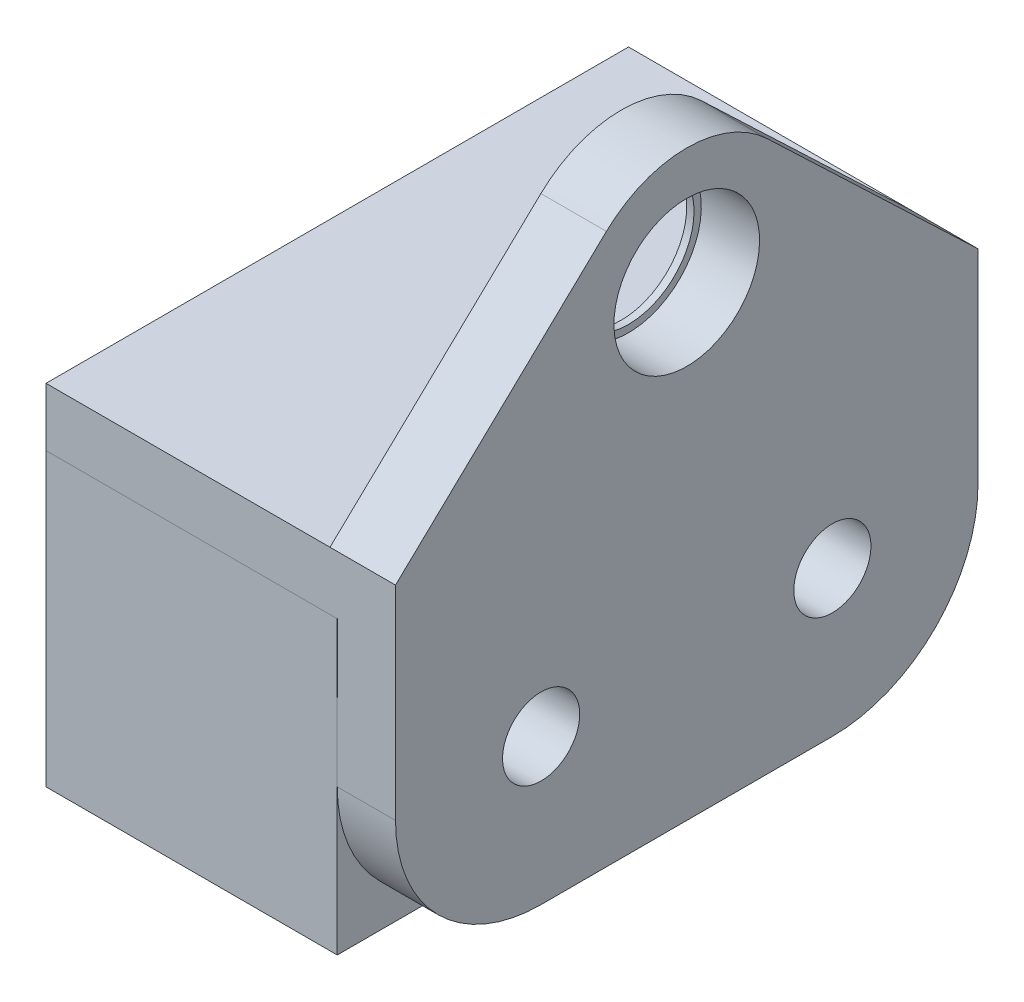
ISO-10303-21;
HEADER;
FILE_DESCRIPTION(('STEP AP214'),'2;1');
FILE_NAME('part.step','',(''),(''),'','','');
FILE_SCHEMA(('AUTOMOTIVE_DESIGN { 1 0 10303 214 1 1 1 1 }'));
ENDSEC;
DATA;
#1=APPLICATION_CONTEXT('core data for automotive mechanical design processes');
#2=APPLICATION_PROTOCOL_DEFINITION('international standard','automotive_design',2000,#1);
#3=PRODUCT_CONTEXT('',#1,'mechanical');
#4=PRODUCT('Part','Part','',(#3));
#5=PRODUCT_RELATED_PRODUCT_CATEGORY('part','',(#4));
#6=PRODUCT_DEFINITION_FORMATION('','',#4);
#7=PRODUCT_DEFINITION_CONTEXT('part definition',#1,'design');
#8=PRODUCT_DEFINITION('design','',#6,#7);
#9=PRODUCT_DEFINITION_SHAPE('','',#8);
#10=(LENGTH_UNIT() NAMED_UNIT(*) SI_UNIT(.MILLI.,.METRE.));
#11=(NAMED_UNIT(*) PLANE_ANGLE_UNIT() SI_UNIT($,.RADIAN.));
#12=(NAMED_UNIT(*) SI_UNIT($,.STERADIAN.) SOLID_ANGLE_UNIT());
#13=UNCERTAINTY_MEASURE_WITH_UNIT(LENGTH_MEASURE(1.E-05),#10,'distance_accuracy_value','');
#14=(GEOMETRIC_REPRESENTATION_CONTEXT(3) GLOBAL_UNCERTAINTY_ASSIGNED_CONTEXT((#13)) GLOBAL_UNIT_ASSIGNED_CONTEXT((#10,
#11,#12)) REPRESENTATION_CONTEXT('',''));
#15=CARTESIAN_POINT('',(0.,0.,0.));
#16=DIRECTION('',(0.,0.,1.));
#17=DIRECTION('',(1.,0.,0.));
#18=AXIS2_PLACEMENT_3D('',#15,#16,#17);
#19=CARTESIAN_POINT('',(-10.,10.,20.));
#20=DIRECTION('',(0.,1.,0.));
#21=DIRECTION('',(-1.,0.,0.));
#22=AXIS2_PLACEMENT_3D('',#19,#20,#21);
#23=PLANE('',#22);
#24=DIRECTION('',(0.,0.,-1.));
#25=VECTOR('',#24,1.);
#26=CARTESIAN_POINT('',(-3.05,10.,8.));
#27=LINE('',#26,#25);
#28=CARTESIAN_POINT('',(-3.05,10.,16.));
#29=VERTEX_POINT('',#28);
#30=CARTESIAN_POINT('',(-3.05,10.,8.));
#31=VERTEX_POINT('',#30);
#32=EDGE_CURVE('E280',#29,#31,#27,.T.);
#33=ORIENTED_EDGE('',*,*,#32,.F.);
#34=DIRECTION('',(-1.,0.,0.));
#35=VECTOR('',#34,1.);
#36=CARTESIAN_POINT('',(-3.05,10.,16.));
#37=LINE('',#36,#35);
#38=CARTESIAN_POINT('',(3.05,10.,16.));
#39=VERTEX_POINT('',#38);
#40=EDGE_CURVE('E285',#39,#29,#37,.T.);
#41=ORIENTED_EDGE('',*,*,#40,.F.);
#42=DIRECTION('',(0.,0.,1.));
#43=VECTOR('',#42,1.);
#44=CARTESIAN_POINT('',(3.05,10.,8.));
#45=LINE('',#44,#43);
#46=CARTESIAN_POINT('',(3.05,10.,8.));
#47=VERTEX_POINT('',#46);
#48=EDGE_CURVE('E294',#47,#39,#45,.T.);
#49=ORIENTED_EDGE('',*,*,#48,.F.);
#50=DIRECTION('',(1.,0.,0.));
#51=VECTOR('',#50,1.);
#52=CARTESIAN_POINT('',(-3.05,10.,8.));
#53=LINE('',#52,#51);
#54=EDGE_CURVE('E291',#31,#47,#53,.T.);
#55=ORIENTED_EDGE('',*,*,#54,.F.);
#56=EDGE_LOOP('',(#33,#41,#49,#55));
#57=FACE_BOUND('',#56,.T.);
#58=DIRECTION('',(0.,0.,1.));
#59=VECTOR('',#58,1.);
#60=CARTESIAN_POINT('',(10.,10.,20.));
#61=LINE('',#60,#59);
#62=CARTESIAN_POINT('',(10.,10.,-20.));
#63=VERTEX_POINT('',#62);
#64=CARTESIAN_POINT('',(10.,10.,20.));
#65=VERTEX_POINT('',#64);
#66=EDGE_CURVE('E306',#63,#65,#61,.T.);
#67=ORIENTED_EDGE('',*,*,#66,.T.);
#68=DIRECTION('',(1.,0.,0.));
#69=VECTOR('',#68,1.);
#70=CARTESIAN_POINT('',(-10.,10.,20.));
#71=LINE('',#70,#69);
#72=CARTESIAN_POINT('',(-10.,10.,20.));
#73=VERTEX_POINT('',#72);
#74=EDGE_CURVE('E317',#73,#65,#71,.T.);
#75=ORIENTED_EDGE('',*,*,#74,.F.);
#76=DIRECTION('',(0.,0.,1.));
#77=VECTOR('',#76,1.);
#78=CARTESIAN_POINT('',(-10.,10.,20.));
#79=LINE('',#78,#77);
#80=CARTESIAN_POINT('',(-10.,10.,-20.));
#81=VERTEX_POINT('',#80);
#82=EDGE_CURVE('E315',#81,#73,#79,.T.);
#83=ORIENTED_EDGE('',*,*,#82,.F.);
#84=DIRECTION('',(1.,0.,0.));
#85=VECTOR('',#84,1.);
#86=CARTESIAN_POINT('',(-10.,10.,-20.));
#87=LINE('',#86,#85);
#88=EDGE_CURVE('E322',#81,#63,#87,.T.);
#89=ORIENTED_EDGE('',*,*,#88,.T.);
#90=EDGE_LOOP('',(#67,#75,#83,#89));
#91=FACE_BOUND('',#90,.T.);
#92=DIRECTION('',(-1.,0.,0.));
#93=VECTOR('',#92,1.);
#94=CARTESIAN_POINT('',(-3.05,10.,-8.));
#95=LINE('',#94,#93);
#96=CARTESIAN_POINT('',(3.05,10.,-8.));
#97=VERTEX_POINT('',#96);
#98=CARTESIAN_POINT('',(-3.05,10.,-8.));
#99=VERTEX_POINT('',#98);
#100=EDGE_CURVE('E253',#97,#99,#95,.T.);
#101=ORIENTED_EDGE('',*,*,#100,.F.);
#102=DIRECTION('',(0.,0.,1.));
#103=VECTOR('',#102,1.);
#104=CARTESIAN_POINT('',(3.05,10.,-8.));
#105=LINE('',#104,#103);
#106=CARTESIAN_POINT('',(3.05,10.,-16.));
#107=VERTEX_POINT('',#106);
#108=EDGE_CURVE('E259',#107,#97,#105,.T.);
#109=ORIENTED_EDGE('',*,*,#108,.F.);
#110=DIRECTION('',(1.,0.,0.));
#111=VECTOR('',#110,1.);
#112=CARTESIAN_POINT('',(-3.05,10.,-16.));
#113=LINE('',#112,#111);
#114=CARTESIAN_POINT('',(-3.05,10.,-16.));
#115=VERTEX_POINT('',#114);
#116=EDGE_CURVE('E268',#115,#107,#113,.T.);
#117=ORIENTED_EDGE('',*,*,#116,.F.);
#118=DIRECTION('',(0.,0.,-1.));
#119=VECTOR('',#118,1.);
#120=CARTESIAN_POINT('',(-3.05,10.,-8.));
#121=LINE('',#120,#119);
#122=EDGE_CURVE('E265',#99,#115,#121,.T.);
#123=ORIENTED_EDGE('',*,*,#122,.F.);
#124=EDGE_LOOP('',(#101,#109,#117,#123));
#125=FACE_BOUND('',#124,.T.);
#126=ADVANCED_FACE('F53',(#57,#91,#125),#23,.F.);
#127=CARTESIAN_POINT('',(9.99999999999999,0.,0.));
#128=DIRECTION('',(1.,0.,0.));
#129=DIRECTION('',(0.,1.,0.));
#130=AXIS2_PLACEMENT_3D('',#127,#128,#129);
#131=PLANE('',#130);
#132=CARTESIAN_POINT('',(9.99999999999999,0.,-10.));
#133=DIRECTION('',(1.,0.,0.));
#134=DIRECTION('',(0.,1.,0.));
#135=AXIS2_PLACEMENT_3D('',#132,#133,#134);
#136=CIRCLE('',#135,2.65);
#137=CARTESIAN_POINT('',(9.99999999999999,2.65,-10.));
#138=VERTEX_POINT('',#137);
#139=EDGE_CURVE('E334',#138,#138,#136,.T.);
#140=ORIENTED_EDGE('',*,*,#139,.T.);
#141=EDGE_LOOP('',(#140));
#142=FACE_BOUND('',#141,.T.);
#143=CARTESIAN_POINT('',(9.99999999999999,0.,10.));
#144=DIRECTION('',(1.,0.,0.));
#145=DIRECTION('',(0.,1.,0.));
#146=AXIS2_PLACEMENT_3D('',#143,#144,#145);
#147=CIRCLE('',#146,2.65);
#148=CARTESIAN_POINT('',(9.99999999999999,2.65,10.));
#149=VERTEX_POINT('',#148);
#150=EDGE_CURVE('E328',#149,#149,#147,.T.);
#151=ORIENTED_EDGE('',*,*,#150,.T.);
#152=EDGE_LOOP('',(#151));
#153=FACE_BOUND('',#152,.T.);
#154=DIRECTION('',(0.,0.,-1.));
#155=VECTOR('',#154,1.);
#156=CARTESIAN_POINT('',(9.99999999999999,-10.,0.));
#157=LINE('',#156,#155);
#158=CARTESIAN_POINT('',(9.99999999999999,-10.,10.));
#159=VERTEX_POINT('',#158);
#160=CARTESIAN_POINT('',(9.99999999999999,-10.,-10.));
#161=VERTEX_POINT('',#160);
#162=EDGE_CURVE('E347',#159,#161,#157,.T.);
#163=ORIENTED_EDGE('',*,*,#162,.F.);
#164=CARTESIAN_POINT('',(9.99999999999999,0.,10.));
#165=DIRECTION('',(1.,0.,0.));
#166=DIRECTION('',(0.,1.,0.));
#167=AXIS2_PLACEMENT_3D('',#164,#165,#166);
#168=CIRCLE('',#167,10.);
#169=CARTESIAN_POINT('',(9.99999999999999,0.,20.));
#170=VERTEX_POINT('',#169);
#171=EDGE_CURVE('E400',#159,#170,#168,.F.);
#172=ORIENTED_EDGE('',*,*,#171,.T.);
#173=DIRECTION('',(0.,1.,0.));
#174=VECTOR('',#173,1.);
#175=CARTESIAN_POINT('',(9.99999999999999,0.,20.));
#176=LINE('',#175,#174);
#177=EDGE_CURVE('E337',#170,#65,#176,.T.);
#178=ORIENTED_EDGE('',*,*,#177,.T.);
#179=ORIENTED_EDGE('',*,*,#66,.F.);
#180=DIRECTION('',(0.,1.,0.));
#181=VECTOR('',#180,1.);
#182=CARTESIAN_POINT('',(9.99999999999999,0.,-20.));
#183=LINE('',#182,#181);
#184=CARTESIAN_POINT('',(9.99999999999999,0.,-20.));
#185=VERTEX_POINT('',#184);
#186=EDGE_CURVE('E341',#185,#63,#183,.T.);
#187=ORIENTED_EDGE('',*,*,#186,.F.);
#188=CARTESIAN_POINT('',(9.99999999999999,0.,-10.));
#189=DIRECTION('',(1.,0.,0.));
#190=DIRECTION('',(0.,1.,0.));
#191=AXIS2_PLACEMENT_3D('',#188,#189,#190);
#192=CIRCLE('',#191,10.);
#193=EDGE_CURVE('E398',#185,#161,#192,.F.);
#194=ORIENTED_EDGE('',*,*,#193,.T.);
#195=EDGE_LOOP('',(#163,#172,#178,#179,#187,#194));
#196=FACE_BOUND('',#195,.T.);
#197=ADVANCED_FACE('F415',(#142,#153,#196),#131,.F.);
#198=CARTESIAN_POINT('',(14.,0.,20.));
#199=DIRECTION('',(0.,0.,1.));
#200=DIRECTION('',(1.,0.,0.));
#201=AXIS2_PLACEMENT_3D('',#198,#199,#200);
#202=PLANE('',#201);
#203=ORIENTED_EDGE('',*,*,#177,.F.);
#204=DIRECTION('',(-1.,0.,0.));
#205=VECTOR('',#204,1.);
#206=CARTESIAN_POINT('',(14.,0.,20.));
#207=LINE('',#206,#205);
#208=CARTESIAN_POINT('',(14.,0.,20.));
#209=VERTEX_POINT('',#208);
#210=EDGE_CURVE('E76',#170,#209,#207,.F.);
#211=ORIENTED_EDGE('',*,*,#210,.T.);
#212=DIRECTION('',(0.,1.,0.));
#213=VECTOR('',#212,1.);
#214=CARTESIAN_POINT('',(14.,0.,20.));
#215=LINE('',#214,#213);
#216=CARTESIAN_POINT('',(14.,14.,20.));
#217=VERTEX_POINT('',#216);
#218=EDGE_CURVE('E338',#209,#217,#215,.T.);
#219=ORIENTED_EDGE('',*,*,#218,.T.);
#220=DIRECTION('',(-1.,0.,0.));
#221=VECTOR('',#220,1.);
#222=CARTESIAN_POINT('',(14.,14.,20.));
#223=LINE('',#222,#221);
#224=CARTESIAN_POINT('',(9.5,14.,20.));
#225=VERTEX_POINT('',#224);
#226=EDGE_CURVE('E351',#217,#225,#223,.T.);
#227=ORIENTED_EDGE('',*,*,#226,.T.);
#228=CARTESIAN_POINT('',(-10.,14.,20.));
#229=VERTEX_POINT('',#228);
#230=EDGE_CURVE('E345',#225,#229,#223,.T.);
#231=ORIENTED_EDGE('',*,*,#230,.T.);
#232=DIRECTION('',(0.,1.,0.));
#233=VECTOR('',#232,1.);
#234=CARTESIAN_POINT('',(-10.,14.,20.));
#235=LINE('',#234,#233);
#236=EDGE_CURVE('E307',#73,#229,#235,.T.);
#237=ORIENTED_EDGE('',*,*,#236,.F.);
#238=ORIENTED_EDGE('',*,*,#74,.T.);
#239=EDGE_LOOP('',(#203,#211,#219,#227,#231,#237,#238));
#240=FACE_BOUND('',#239,.T.);
#241=ADVANCED_FACE('F417',(#240),#202,.T.);
#242=CARTESIAN_POINT('',(14.,-10.,0.));
#243=DIRECTION('',(0.,1.,0.));
#244=DIRECTION('',(-1.,0.,0.));
#245=AXIS2_PLACEMENT_3D('',#242,#243,#244);
#246=PLANE('',#245);
#247=DIRECTION('',(0.,0.,-1.));
#248=VECTOR('',#247,1.);
#249=CARTESIAN_POINT('',(14.,-10.,0.));
#250=LINE('',#249,#248);
#251=CARTESIAN_POINT('',(14.,-10.,10.));
#252=VERTEX_POINT('',#251);
#253=CARTESIAN_POINT('',(14.,-10.,-10.));
#254=VERTEX_POINT('',#253);
#255=EDGE_CURVE('E340',#252,#254,#250,.T.);
#256=ORIENTED_EDGE('',*,*,#255,.F.);
#257=DIRECTION('',(-1.,0.,0.));
#258=VECTOR('',#257,1.);
#259=CARTESIAN_POINT('',(9.99999999999999,-10.,10.));
#260=LINE('',#259,#258);
#261=EDGE_CURVE('E395',#252,#159,#260,.T.);
#262=ORIENTED_EDGE('',*,*,#261,.T.);
#263=ORIENTED_EDGE('',*,*,#162,.T.);
#264=DIRECTION('',(-1.,0.,0.));
#265=VECTOR('',#264,1.);
#266=CARTESIAN_POINT('',(14.,-10.,-10.));
#267=LINE('',#266,#265);
#268=EDGE_CURVE('E393',#161,#254,#267,.F.);
#269=ORIENTED_EDGE('',*,*,#268,.T.);
#270=EDGE_LOOP('',(#256,#262,#263,#269));
#271=FACE_BOUND('',#270,.T.);
#272=ADVANCED_FACE('F410',(#271),#246,.F.);
#273=CARTESIAN_POINT('',(14.,0.,-20.));
#274=DIRECTION('',(0.,0.,1.));
#275=DIRECTION('',(1.,0.,0.));
#276=AXIS2_PLACEMENT_3D('',#273,#274,#275);
#277=PLANE('',#276);
#278=DIRECTION('',(0.,1.,0.));
#279=VECTOR('',#278,1.);
#280=CARTESIAN_POINT('',(14.,0.,-20.));
#281=LINE('',#280,#279);
#282=CARTESIAN_POINT('',(14.,0.,-20.));
#283=VERTEX_POINT('',#282);
#284=CARTESIAN_POINT('',(14.,14.,-20.));
#285=VERTEX_POINT('',#284);
#286=EDGE_CURVE('E343',#283,#285,#281,.T.);
#287=ORIENTED_EDGE('',*,*,#286,.F.);
#288=DIRECTION('',(-1.,0.,0.));
#289=VECTOR('',#288,1.);
#290=CARTESIAN_POINT('',(14.,0.,-20.));
#291=LINE('',#290,#289);
#292=EDGE_CURVE('E13',#283,#185,#291,.T.);
#293=ORIENTED_EDGE('',*,*,#292,.T.);
#294=ORIENTED_EDGE('',*,*,#186,.T.);
#295=ORIENTED_EDGE('',*,*,#88,.F.);
#296=DIRECTION('',(0.,-1.,0.));
#297=VECTOR('',#296,1.);
#298=CARTESIAN_POINT('',(-10.,14.,-20.));
#299=LINE('',#298,#297);
#300=CARTESIAN_POINT('',(-10.,14.,-20.));
#301=VERTEX_POINT('',#300);
#302=EDGE_CURVE('E313',#301,#81,#299,.T.);
#303=ORIENTED_EDGE('',*,*,#302,.F.);
#304=DIRECTION('',(-1.,0.,0.));
#305=VECTOR('',#304,1.);
#306=CARTESIAN_POINT('',(14.,14.,-20.));
#307=LINE('',#306,#305);
#308=CARTESIAN_POINT('',(9.5,14.,-20.));
#309=VERTEX_POINT('',#308);
#310=EDGE_CURVE('E353',#309,#301,#307,.T.);
#311=ORIENTED_EDGE('',*,*,#310,.F.);
#312=EDGE_CURVE('E354',#285,#309,#307,.T.);
#313=ORIENTED_EDGE('',*,*,#312,.F.);
#314=EDGE_LOOP('',(#287,#293,#294,#295,#303,#311,#313));
#315=FACE_BOUND('',#314,.T.);
#316=ADVANCED_FACE('F426',(#315),#277,.F.);
#317=CARTESIAN_POINT('',(14.,14.,0.));
#318=DIRECTION('',(0.,1.,0.));
#319=DIRECTION('',(-1.,0.,0.));
#320=AXIS2_PLACEMENT_3D('',#317,#318,#319);
#321=PLANE('',#320);
#322=DIRECTION('',(0.,0.,1.));
#323=VECTOR('',#322,1.);
#324=CARTESIAN_POINT('',(9.5,14.,0.));
#325=LINE('',#324,#323);
#326=EDGE_CURVE('E219',#309,#225,#325,.T.);
#327=ORIENTED_EDGE('',*,*,#326,.F.);
#328=ORIENTED_EDGE('',*,*,#310,.T.);
#329=DIRECTION('',(0.,0.,-1.));
#330=VECTOR('',#329,1.);
#331=CARTESIAN_POINT('',(-10.,14.,20.));
#332=LINE('',#331,#330);
#333=EDGE_CURVE('E310',#229,#301,#332,.T.);
#334=ORIENTED_EDGE('',*,*,#333,.F.);
#335=ORIENTED_EDGE('',*,*,#230,.F.);
#336=EDGE_LOOP('',(#327,#328,#334,#335));
#337=FACE_BOUND('',#336,.T.);
#338=ADVANCED_FACE('F459',(#337),#321,.T.);
#339=CARTESIAN_POINT('',(14.,0.,0.));
#340=DIRECTION('',(1.,0.,0.));
#341=DIRECTION('',(0.,1.,0.));
#342=AXIS2_PLACEMENT_3D('',#339,#340,#341);
#343=PLANE('',#342);
#344=CARTESIAN_POINT('',(14.,0.,10.));
#345=DIRECTION('',(1.,0.,0.));
#346=DIRECTION('',(0.,0.,-1.));
#347=AXIS2_PLACEMENT_3D('',#344,#345,#346);
#348=CIRCLE('',#347,2.65);
#349=CARTESIAN_POINT('',(14.,0.,7.35));
#350=VERTEX_POINT('',#349);
#351=EDGE_CURVE('E325',#350,#350,#348,.T.);
#352=ORIENTED_EDGE('',*,*,#351,.F.);
#353=EDGE_LOOP('',(#352));
#354=FACE_BOUND('',#353,.T.);
#355=CARTESIAN_POINT('',(14.,0.,-10.));
#356=DIRECTION('',(1.,0.,0.));
#357=DIRECTION('',(0.,0.,-1.));
#358=AXIS2_PLACEMENT_3D('',#355,#356,#357);
#359=CIRCLE('',#358,2.65);
#360=CARTESIAN_POINT('',(14.,0.,-12.65));
#361=VERTEX_POINT('',#360);
#362=EDGE_CURVE('E331',#361,#361,#359,.T.);
#363=ORIENTED_EDGE('',*,*,#362,.F.);
#364=EDGE_LOOP('',(#363));
#365=FACE_BOUND('',#364,.T.);
#366=ORIENTED_EDGE('',*,*,#218,.F.);
#367=CARTESIAN_POINT('',(14.,0.,10.));
#368=DIRECTION('',(1.,0.,0.));
#369=DIRECTION('',(0.,1.,0.));
#370=AXIS2_PLACEMENT_3D('',#367,#368,#369);
#371=CIRCLE('',#370,10.);
#372=EDGE_CURVE('E61',#209,#252,#371,.T.);
#373=ORIENTED_EDGE('',*,*,#372,.T.);
#374=ORIENTED_EDGE('',*,*,#255,.T.);
#375=CARTESIAN_POINT('',(14.,0.,-10.));
#376=DIRECTION('',(1.,0.,0.));
#377=DIRECTION('',(0.,1.,0.));
#378=AXIS2_PLACEMENT_3D('',#375,#376,#377);
#379=CIRCLE('',#378,10.);
#380=EDGE_CURVE('E68',#254,#283,#379,.T.);
#381=ORIENTED_EDGE('',*,*,#380,.T.);
#382=ORIENTED_EDGE('',*,*,#286,.T.);
#383=DIRECTION('',(0.,-0.689655172413793,-0.724137931034483));
#384=VECTOR('',#383,1.);
#385=CARTESIAN_POINT('',(14.,17.3293697978597,-16.5041617122473));
#386=LINE('',#385,#384);
#387=CARTESIAN_POINT('',(14.,27.7931034482759,-5.51724137931034));
#388=VERTEX_POINT('',#387);
#389=EDGE_CURVE('E239',#388,#285,#386,.T.);
#390=ORIENTED_EDGE('',*,*,#389,.F.);
#391=CARTESIAN_POINT('',(14.,22.,0.));
#392=DIRECTION('',(1.,0.,0.));
#393=DIRECTION('',(0.,1.,0.));
#394=AXIS2_PLACEMENT_3D('',#391,#392,#393);
#395=CIRCLE('',#394,8.);
#396=CARTESIAN_POINT('',(14.,27.7931034482759,5.51724137931034));
#397=VERTEX_POINT('',#396);
#398=EDGE_CURVE('E247',#397,#388,#395,.F.);
#399=ORIENTED_EDGE('',*,*,#398,.F.);
#400=DIRECTION('',(0.,0.689655172413793,-0.724137931034483));
#401=VECTOR('',#400,1.);
#402=CARTESIAN_POINT('',(14.,17.3293697978597,16.5041617122473));
#403=LINE('',#402,#401);
#404=EDGE_CURVE('E227',#217,#397,#403,.T.);
#405=ORIENTED_EDGE('',*,*,#404,.F.);
#406=EDGE_LOOP('',(#366,#373,#374,#381,#382,#390,#399,#405));
#407=FACE_BOUND('',#406,.T.);
#408=CARTESIAN_POINT('',(14.,22.,0.));
#409=DIRECTION('',(1.,0.,0.));
#410=DIRECTION('',(0.,1.,0.));
#411=AXIS2_PLACEMENT_3D('',#408,#409,#410);
#412=CIRCLE('',#411,5.);
#413=CARTESIAN_POINT('',(14.,27.,0.));
#414=VERTEX_POINT('',#413);
#415=EDGE_CURVE('E236',#414,#414,#412,.T.);
#416=ORIENTED_EDGE('',*,*,#415,.F.);
#417=EDGE_LOOP('',(#416));
#418=FACE_BOUND('',#417,.T.);
#419=ADVANCED_FACE('F405',(#354,#365,#407,#418),#343,.T.);
#420=CARTESIAN_POINT('',(14.,0.,-10.));
#421=DIRECTION('',(1.,0.,0.));
#422=DIRECTION('',(0.,0.,-1.));
#423=AXIS2_PLACEMENT_3D('',#420,#421,#422);
#424=CYLINDRICAL_SURFACE('',#423,2.65);
#425=ORIENTED_EDGE('',*,*,#139,.F.);
#426=EDGE_LOOP('',(#425));
#427=FACE_BOUND('',#426,.T.);
#428=ORIENTED_EDGE('',*,*,#362,.T.);
#429=EDGE_LOOP('',(#428));
#430=FACE_BOUND('',#429,.T.);
#431=ADVANCED_FACE('F453',(#427,#430),#424,.F.);
#432=CARTESIAN_POINT('',(14.,0.,10.));
#433=DIRECTION('',(1.,0.,0.));
#434=DIRECTION('',(0.,0.,-1.));
#435=AXIS2_PLACEMENT_3D('',#432,#433,#434);
#436=CYLINDRICAL_SURFACE('',#435,2.65);
#437=ORIENTED_EDGE('',*,*,#150,.F.);
#438=EDGE_LOOP('',(#437));
#439=FACE_BOUND('',#438,.T.);
#440=ORIENTED_EDGE('',*,*,#351,.T.);
#441=EDGE_LOOP('',(#440));
#442=FACE_BOUND('',#441,.T.);
#443=ADVANCED_FACE('F450',(#439,#442),#436,.F.);
#444=CARTESIAN_POINT('',(-10.,0.,0.));
#445=DIRECTION('',(1.,0.,0.));
#446=DIRECTION('',(0.,0.,-1.));
#447=AXIS2_PLACEMENT_3D('',#444,#445,#446);
#448=PLANE('',#447);
#449=ORIENTED_EDGE('',*,*,#236,.T.);
#450=ORIENTED_EDGE('',*,*,#333,.T.);
#451=ORIENTED_EDGE('',*,*,#302,.T.);
#452=ORIENTED_EDGE('',*,*,#82,.T.);
#453=EDGE_LOOP('',(#449,#450,#451,#452));
#454=FACE_BOUND('',#453,.T.);
#455=ADVANCED_FACE('F448',(#454),#448,.F.);
#456=CARTESIAN_POINT('',(-3.05,7.,8.));
#457=DIRECTION('',(1.,0.,0.));
#458=DIRECTION('',(0.,1.,0.));
#459=AXIS2_PLACEMENT_3D('',#456,#457,#458);
#460=PLANE('',#459);
#461=DIRECTION('',(0.,1.,0.));
#462=VECTOR('',#461,1.);
#463=CARTESIAN_POINT('',(-3.05,7.,8.));
#464=LINE('',#463,#462);
#465=CARTESIAN_POINT('',(-3.05,8.,8.));
#466=VERTEX_POINT('',#465);
#467=EDGE_CURVE('E304',#466,#31,#464,.T.);
#468=ORIENTED_EDGE('',*,*,#467,.F.);
#469=DIRECTION('',(0.,0.,1.));
#470=VECTOR('',#469,1.);
#471=CARTESIAN_POINT('',(-3.05,8.,8.));
#472=LINE('',#471,#470);
#473=CARTESIAN_POINT('',(-3.05,8.,16.));
#474=VERTEX_POINT('',#473);
#475=EDGE_CURVE('E367',#466,#474,#472,.T.);
#476=ORIENTED_EDGE('',*,*,#475,.T.);
#477=DIRECTION('',(0.,1.,0.));
#478=VECTOR('',#477,1.);
#479=CARTESIAN_POINT('',(-3.05,7.,16.));
#480=LINE('',#479,#478);
#481=EDGE_CURVE('E288',#474,#29,#480,.T.);
#482=ORIENTED_EDGE('',*,*,#481,.T.);
#483=ORIENTED_EDGE('',*,*,#32,.T.);
#484=EDGE_LOOP('',(#468,#476,#482,#483));
#485=FACE_BOUND('',#484,.T.);
#486=ADVANCED_FACE('F541',(#485),#460,.F.);
#487=CARTESIAN_POINT('',(-3.05,7.,8.));
#488=DIRECTION('',(0.,0.,1.));
#489=DIRECTION('',(1.,0.,0.));
#490=AXIS2_PLACEMENT_3D('',#487,#488,#489);
#491=PLANE('',#490);
#492=DIRECTION('',(1.,0.,0.));
#493=VECTOR('',#492,1.);
#494=CARTESIAN_POINT('',(-3.05,7.,8.));
#495=LINE('',#494,#493);
#496=CARTESIAN_POINT('',(-2.05000000000001,7.,8.));
#497=VERTEX_POINT('',#496);
#498=CARTESIAN_POINT('',(2.05000000000001,7.,8.));
#499=VERTEX_POINT('',#498);
#500=EDGE_CURVE('E281',#497,#499,#495,.T.);
#501=ORIENTED_EDGE('',*,*,#500,.F.);
#502=DIRECTION('',(0.707106781186545,-0.70710678118655,0.));
#503=VECTOR('',#502,1.);
#504=CARTESIAN_POINT('',(-2.05000000000001,7.,8.));
#505=LINE('',#504,#503);
#506=EDGE_CURVE('E365',#497,#466,#505,.F.);
#507=ORIENTED_EDGE('',*,*,#506,.T.);
#508=ORIENTED_EDGE('',*,*,#467,.T.);
#509=ORIENTED_EDGE('',*,*,#54,.T.);
#510=DIRECTION('',(0.,1.,0.));
#511=VECTOR('',#510,1.);
#512=CARTESIAN_POINT('',(3.05,7.,8.));
#513=LINE('',#512,#511);
#514=CARTESIAN_POINT('',(3.05,8.,8.));
#515=VERTEX_POINT('',#514);
#516=EDGE_CURVE('E302',#515,#47,#513,.T.);
#517=ORIENTED_EDGE('',*,*,#516,.F.);
#518=DIRECTION('',(0.707106781186545,0.70710678118655,0.));
#519=VECTOR('',#518,1.);
#520=CARTESIAN_POINT('',(2.05000000000001,7.,8.));
#521=LINE('',#520,#519);
#522=EDGE_CURVE('E363',#515,#499,#521,.F.);
#523=ORIENTED_EDGE('',*,*,#522,.T.);
#524=EDGE_LOOP('',(#501,#507,#508,#509,#517,#523));
#525=FACE_BOUND('',#524,.T.);
#526=ADVANCED_FACE('F538',(#525),#491,.F.);
#527=CARTESIAN_POINT('',(3.05,7.,8.));
#528=DIRECTION('',(-1.,0.,0.));
#529=DIRECTION('',(0.,-1.,0.));
#530=AXIS2_PLACEMENT_3D('',#527,#528,#529);
#531=PLANE('',#530);
#532=DIRECTION('',(0.,1.,0.));
#533=VECTOR('',#532,1.);
#534=CARTESIAN_POINT('',(3.05,7.,16.));
#535=LINE('',#534,#533);
#536=CARTESIAN_POINT('',(3.05,8.,16.));
#537=VERTEX_POINT('',#536);
#538=EDGE_CURVE('E300',#537,#39,#535,.T.);
#539=ORIENTED_EDGE('',*,*,#538,.F.);
#540=DIRECTION('',(0.,0.,-1.));
#541=VECTOR('',#540,1.);
#542=CARTESIAN_POINT('',(3.05,8.,8.));
#543=LINE('',#542,#541);
#544=EDGE_CURVE('E373',#537,#515,#543,.T.);
#545=ORIENTED_EDGE('',*,*,#544,.T.);
#546=ORIENTED_EDGE('',*,*,#516,.T.);
#547=ORIENTED_EDGE('',*,*,#48,.T.);
#548=EDGE_LOOP('',(#539,#545,#546,#547));
#549=FACE_BOUND('',#548,.T.);
#550=ADVANCED_FACE('F534',(#549),#531,.F.);
#551=CARTESIAN_POINT('',(-3.05,7.,16.));
#552=DIRECTION('',(0.,0.,-1.));
#553=DIRECTION('',(-1.,0.,0.));
#554=AXIS2_PLACEMENT_3D('',#551,#552,#553);
#555=PLANE('',#554);
#556=ORIENTED_EDGE('',*,*,#481,.F.);
#557=DIRECTION('',(-0.707106781186545,0.70710678118655,0.));
#558=VECTOR('',#557,1.);
#559=CARTESIAN_POINT('',(-2.05000000000001,7.,16.));
#560=LINE('',#559,#558);
#561=CARTESIAN_POINT('',(-2.05000000000001,7.,16.));
#562=VERTEX_POINT('',#561);
#563=EDGE_CURVE('E371',#474,#562,#560,.F.);
#564=ORIENTED_EDGE('',*,*,#563,.T.);
#565=DIRECTION('',(-1.,0.,0.));
#566=VECTOR('',#565,1.);
#567=CARTESIAN_POINT('',(-3.05,7.,16.));
#568=LINE('',#567,#566);
#569=CARTESIAN_POINT('',(2.05000000000001,7.,16.));
#570=VERTEX_POINT('',#569);
#571=EDGE_CURVE('E284',#570,#562,#568,.T.);
#572=ORIENTED_EDGE('',*,*,#571,.F.);
#573=DIRECTION('',(-0.707106781186545,-0.70710678118655,0.));
#574=VECTOR('',#573,1.);
#575=CARTESIAN_POINT('',(2.05000000000001,7.,16.));
#576=LINE('',#575,#574);
#577=EDGE_CURVE('E369',#570,#537,#576,.F.);
#578=ORIENTED_EDGE('',*,*,#577,.T.);
#579=ORIENTED_EDGE('',*,*,#538,.T.);
#580=ORIENTED_EDGE('',*,*,#40,.T.);
#581=EDGE_LOOP('',(#556,#564,#572,#578,#579,#580));
#582=FACE_BOUND('',#581,.T.);
#583=ADVANCED_FACE('F530',(#582),#555,.F.);
#584=CARTESIAN_POINT('',(0.,7.,0.));
#585=DIRECTION('',(0.,1.,0.));
#586=DIRECTION('',(0.,0.,1.));
#587=AXIS2_PLACEMENT_3D('',#584,#585,#586);
#588=PLANE('',#587);
#589=ORIENTED_EDGE('',*,*,#571,.T.);
#590=DIRECTION('',(0.,0.,-1.));
#591=VECTOR('',#590,1.);
#592=CARTESIAN_POINT('',(-2.05000000000001,7.,0.));
#593=LINE('',#592,#591);
#594=EDGE_CURVE('E360',#562,#497,#593,.T.);
#595=ORIENTED_EDGE('',*,*,#594,.T.);
#596=ORIENTED_EDGE('',*,*,#500,.T.);
#597=DIRECTION('',(0.,0.,1.));
#598=VECTOR('',#597,1.);
#599=CARTESIAN_POINT('',(2.05000000000001,7.,0.));
#600=LINE('',#599,#598);
#601=EDGE_CURVE('E357',#499,#570,#600,.T.);
#602=ORIENTED_EDGE('',*,*,#601,.T.);
#603=EDGE_LOOP('',(#589,#595,#596,#602));
#604=FACE_BOUND('',#603,.T.);
#605=ADVANCED_FACE('F524',(#604),#588,.F.);
#606=CARTESIAN_POINT('',(-3.05,7.,-8.));
#607=DIRECTION('',(0.,0.,-1.));
#608=DIRECTION('',(-1.,0.,0.));
#609=AXIS2_PLACEMENT_3D('',#606,#607,#608);
#610=PLANE('',#609);
#611=DIRECTION('',(-1.,0.,0.));
#612=VECTOR('',#611,1.);
#613=CARTESIAN_POINT('',(-3.05,7.,-8.));
#614=LINE('',#613,#612);
#615=CARTESIAN_POINT('',(2.05000000000001,7.,-8.));
#616=VERTEX_POINT('',#615);
#617=CARTESIAN_POINT('',(-2.05000000000001,7.,-8.));
#618=VERTEX_POINT('',#617);
#619=EDGE_CURVE('E255',#616,#618,#614,.T.);
#620=ORIENTED_EDGE('',*,*,#619,.F.);
#621=DIRECTION('',(-0.707106781186545,-0.70710678118655,0.));
#622=VECTOR('',#621,1.);
#623=CARTESIAN_POINT('',(2.05000000000001,7.,-8.));
#624=LINE('',#623,#622);
#625=CARTESIAN_POINT('',(3.05,8.,-8.));
#626=VERTEX_POINT('',#625);
#627=EDGE_CURVE('E383',#616,#626,#624,.F.);
#628=ORIENTED_EDGE('',*,*,#627,.T.);
#629=DIRECTION('',(0.,1.,0.));
#630=VECTOR('',#629,1.);
#631=CARTESIAN_POINT('',(3.05,7.,-8.));
#632=LINE('',#631,#630);
#633=EDGE_CURVE('E262',#626,#97,#632,.T.);
#634=ORIENTED_EDGE('',*,*,#633,.T.);
#635=ORIENTED_EDGE('',*,*,#100,.T.);
#636=DIRECTION('',(0.,1.,0.));
#637=VECTOR('',#636,1.);
#638=CARTESIAN_POINT('',(-3.05,7.,-8.));
#639=LINE('',#638,#637);
#640=CARTESIAN_POINT('',(-3.05,8.,-8.));
#641=VERTEX_POINT('',#640);
#642=EDGE_CURVE('E278',#641,#99,#639,.T.);
#643=ORIENTED_EDGE('',*,*,#642,.F.);
#644=DIRECTION('',(-0.707106781186545,0.70710678118655,0.));
#645=VECTOR('',#644,1.);
#646=CARTESIAN_POINT('',(-2.05000000000001,7.,-8.));
#647=LINE('',#646,#645);
#648=EDGE_CURVE('E381',#641,#618,#647,.F.);
#649=ORIENTED_EDGE('',*,*,#648,.T.);
#650=EDGE_LOOP('',(#620,#628,#634,#635,#643,#649));
#651=FACE_BOUND('',#650,.T.);
#652=ADVANCED_FACE('F498',(#651),#610,.F.);
#653=CARTESIAN_POINT('',(-3.05,7.,-8.));
#654=DIRECTION('',(1.,0.,0.));
#655=DIRECTION('',(0.,1.,0.));
#656=AXIS2_PLACEMENT_3D('',#653,#654,#655);
#657=PLANE('',#656);
#658=DIRECTION('',(0.,1.,0.));
#659=VECTOR('',#658,1.);
#660=CARTESIAN_POINT('',(-3.05,7.,-16.));
#661=LINE('',#660,#659);
#662=CARTESIAN_POINT('',(-3.05,8.,-16.));
#663=VERTEX_POINT('',#662);
#664=EDGE_CURVE('E276',#663,#115,#661,.T.);
#665=ORIENTED_EDGE('',*,*,#664,.F.);
#666=DIRECTION('',(0.,0.,1.));
#667=VECTOR('',#666,1.);
#668=CARTESIAN_POINT('',(-3.05,8.,-8.));
#669=LINE('',#668,#667);
#670=EDGE_CURVE('E391',#663,#641,#669,.T.);
#671=ORIENTED_EDGE('',*,*,#670,.T.);
#672=ORIENTED_EDGE('',*,*,#642,.T.);
#673=ORIENTED_EDGE('',*,*,#122,.T.);
#674=EDGE_LOOP('',(#665,#671,#672,#673));
#675=FACE_BOUND('',#674,.T.);
#676=ADVANCED_FACE('F516',(#675),#657,.F.);
#677=CARTESIAN_POINT('',(-3.05,7.,-16.));
#678=DIRECTION('',(0.,0.,1.));
#679=DIRECTION('',(1.,0.,0.));
#680=AXIS2_PLACEMENT_3D('',#677,#678,#679);
#681=PLANE('',#680);
#682=DIRECTION('',(0.,1.,0.));
#683=VECTOR('',#682,1.);
#684=CARTESIAN_POINT('',(3.05,7.,-16.));
#685=LINE('',#684,#683);
#686=CARTESIAN_POINT('',(3.05,8.,-16.));
#687=VERTEX_POINT('',#686);
#688=EDGE_CURVE('E274',#687,#107,#685,.T.);
#689=ORIENTED_EDGE('',*,*,#688,.F.);
#690=DIRECTION('',(0.707106781186545,0.70710678118655,0.));
#691=VECTOR('',#690,1.);
#692=CARTESIAN_POINT('',(2.05000000000001,7.,-16.));
#693=LINE('',#692,#691);
#694=CARTESIAN_POINT('',(2.05000000000001,7.,-16.));
#695=VERTEX_POINT('',#694);
#696=EDGE_CURVE('E389',#687,#695,#693,.F.);
#697=ORIENTED_EDGE('',*,*,#696,.T.);
#698=DIRECTION('',(1.,0.,0.));
#699=VECTOR('',#698,1.);
#700=CARTESIAN_POINT('',(-3.05,7.,-16.));
#701=LINE('',#700,#699);
#702=CARTESIAN_POINT('',(-2.05000000000001,7.,-16.));
#703=VERTEX_POINT('',#702);
#704=EDGE_CURVE('E258',#703,#695,#701,.T.);
#705=ORIENTED_EDGE('',*,*,#704,.F.);
#706=DIRECTION('',(0.707106781186545,-0.70710678118655,0.));
#707=VECTOR('',#706,1.);
#708=CARTESIAN_POINT('',(-2.05000000000001,7.,-16.));
#709=LINE('',#708,#707);
#710=EDGE_CURVE('E387',#703,#663,#709,.F.);
#711=ORIENTED_EDGE('',*,*,#710,.T.);
#712=ORIENTED_EDGE('',*,*,#664,.T.);
#713=ORIENTED_EDGE('',*,*,#116,.T.);
#714=EDGE_LOOP('',(#689,#697,#705,#711,#712,#713));
#715=FACE_BOUND('',#714,.T.);
#716=ADVANCED_FACE('F513',(#715),#681,.F.);
#717=CARTESIAN_POINT('',(3.05,7.,-8.));
#718=DIRECTION('',(-1.,0.,0.));
#719=DIRECTION('',(0.,-1.,0.));
#720=AXIS2_PLACEMENT_3D('',#717,#718,#719);
#721=PLANE('',#720);
#722=ORIENTED_EDGE('',*,*,#633,.F.);
#723=DIRECTION('',(0.,0.,-1.));
#724=VECTOR('',#723,1.);
#725=CARTESIAN_POINT('',(3.05,8.,-8.));
#726=LINE('',#725,#724);
#727=EDGE_CURVE('E385',#626,#687,#726,.T.);
#728=ORIENTED_EDGE('',*,*,#727,.T.);
#729=ORIENTED_EDGE('',*,*,#688,.T.);
#730=ORIENTED_EDGE('',*,*,#108,.T.);
#731=EDGE_LOOP('',(#722,#728,#729,#730));
#732=FACE_BOUND('',#731,.T.);
#733=ADVANCED_FACE('F507',(#732),#721,.F.);
#734=CARTESIAN_POINT('',(0.,7.,0.));
#735=DIRECTION('',(0.,1.,0.));
#736=DIRECTION('',(0.,0.,1.));
#737=AXIS2_PLACEMENT_3D('',#734,#735,#736);
#738=PLANE('',#737);
#739=ORIENTED_EDGE('',*,*,#704,.T.);
#740=DIRECTION('',(0.,0.,1.));
#741=VECTOR('',#740,1.);
#742=CARTESIAN_POINT('',(2.05000000000001,7.,0.));
#743=LINE('',#742,#741);
#744=EDGE_CURVE('E378',#695,#616,#743,.T.);
#745=ORIENTED_EDGE('',*,*,#744,.T.);
#746=ORIENTED_EDGE('',*,*,#619,.T.);
#747=DIRECTION('',(0.,0.,-1.));
#748=VECTOR('',#747,1.);
#749=CARTESIAN_POINT('',(-2.05000000000001,7.,0.));
#750=LINE('',#749,#748);
#751=EDGE_CURVE('E375',#618,#703,#750,.T.);
#752=ORIENTED_EDGE('',*,*,#751,.T.);
#753=EDGE_LOOP('',(#739,#745,#746,#752));
#754=FACE_BOUND('',#753,.T.);
#755=ADVANCED_FACE('F475',(#754),#738,.F.);
#756=CARTESIAN_POINT('',(-2.05000000000001,7.,0.));
#757=DIRECTION('',(0.70710678118655,0.707106781186545,0.));
#758=DIRECTION('',(0.,0.,-1.));
#759=AXIS2_PLACEMENT_3D('',#756,#757,#758);
#760=PLANE('',#759);
#761=ORIENTED_EDGE('',*,*,#563,.F.);
#762=ORIENTED_EDGE('',*,*,#475,.F.);
#763=ORIENTED_EDGE('',*,*,#506,.F.);
#764=ORIENTED_EDGE('',*,*,#594,.F.);
#765=EDGE_LOOP('',(#761,#762,#763,#764));
#766=FACE_BOUND('',#765,.T.);
#767=ADVANCED_FACE('F471',(#766),#760,.F.);
#768=CARTESIAN_POINT('',(2.05000000000001,7.,0.));
#769=DIRECTION('',(-0.70710678118655,0.707106781186545,0.));
#770=DIRECTION('',(0.,0.,1.));
#771=AXIS2_PLACEMENT_3D('',#768,#769,#770);
#772=PLANE('',#771);
#773=ORIENTED_EDGE('',*,*,#522,.F.);
#774=ORIENTED_EDGE('',*,*,#544,.F.);
#775=ORIENTED_EDGE('',*,*,#577,.F.);
#776=ORIENTED_EDGE('',*,*,#601,.F.);
#777=EDGE_LOOP('',(#773,#774,#775,#776));
#778=FACE_BOUND('',#777,.T.);
#779=ADVANCED_FACE('F474',(#778),#772,.F.);
#780=CARTESIAN_POINT('',(2.05000000000001,7.,0.));
#781=DIRECTION('',(-0.70710678118655,0.707106781186545,0.));
#782=DIRECTION('',(0.,0.,1.));
#783=AXIS2_PLACEMENT_3D('',#780,#781,#782);
#784=PLANE('',#783);
#785=ORIENTED_EDGE('',*,*,#696,.F.);
#786=ORIENTED_EDGE('',*,*,#727,.F.);
#787=ORIENTED_EDGE('',*,*,#627,.F.);
#788=ORIENTED_EDGE('',*,*,#744,.F.);
#789=EDGE_LOOP('',(#785,#786,#787,#788));
#790=FACE_BOUND('',#789,.T.);
#791=ADVANCED_FACE('F479',(#790),#784,.F.);
#792=CARTESIAN_POINT('',(-2.05000000000001,7.,0.));
#793=DIRECTION('',(0.70710678118655,0.707106781186545,0.));
#794=DIRECTION('',(0.,0.,-1.));
#795=AXIS2_PLACEMENT_3D('',#792,#793,#794);
#796=PLANE('',#795);
#797=ORIENTED_EDGE('',*,*,#648,.F.);
#798=ORIENTED_EDGE('',*,*,#670,.F.);
#799=ORIENTED_EDGE('',*,*,#710,.F.);
#800=ORIENTED_EDGE('',*,*,#751,.F.);
#801=EDGE_LOOP('',(#797,#798,#799,#800));
#802=FACE_BOUND('',#801,.T.);
#803=ADVANCED_FACE('F483',(#802),#796,.F.);
#804=CARTESIAN_POINT('',(9.5,22.,0.));
#805=DIRECTION('',(1.,0.,0.));
#806=DIRECTION('',(0.,1.,0.));
#807=AXIS2_PLACEMENT_3D('',#804,#805,#806);
#808=CYLINDRICAL_SURFACE('',#807,8.);
#809=ORIENTED_EDGE('',*,*,#398,.T.);
#810=DIRECTION('',(1.,0.,0.));
#811=VECTOR('',#810,1.);
#812=CARTESIAN_POINT('',(9.5,27.7931034482759,-5.51724137931034));
#813=LINE('',#812,#811);
#814=CARTESIAN_POINT('',(9.5,27.7931034482759,-5.51724137931034));
#815=VERTEX_POINT('',#814);
#816=EDGE_CURVE('E231',#815,#388,#813,.T.);
#817=ORIENTED_EDGE('',*,*,#816,.F.);
#818=CARTESIAN_POINT('',(9.5,22.,0.));
#819=DIRECTION('',(1.,0.,0.));
#820=DIRECTION('',(0.,1.,0.));
#821=AXIS2_PLACEMENT_3D('',#818,#819,#820);
#822=CIRCLE('',#821,8.);
#823=CARTESIAN_POINT('',(9.5,27.7931034482759,5.51724137931034));
#824=VERTEX_POINT('',#823);
#825=EDGE_CURVE('E217',#824,#815,#822,.F.);
#826=ORIENTED_EDGE('',*,*,#825,.F.);
#827=DIRECTION('',(1.,0.,0.));
#828=VECTOR('',#827,1.);
#829=CARTESIAN_POINT('',(9.5,27.7931034482759,5.51724137931034));
#830=LINE('',#829,#828);
#831=EDGE_CURVE('E224',#824,#397,#830,.T.);
#832=ORIENTED_EDGE('',*,*,#831,.T.);
#833=EDGE_LOOP('',(#809,#817,#826,#832));
#834=FACE_BOUND('',#833,.T.);
#835=ADVANCED_FACE('F234',(#834),#808,.T.);
#836=CARTESIAN_POINT('',(9.5,17.3293697978597,-16.5041617122473));
#837=DIRECTION('',(0.,-0.724137931034483,0.689655172413793));
#838=DIRECTION('',(0.,-0.689655172413793,-0.724137931034483));
#839=AXIS2_PLACEMENT_3D('',#836,#837,#838);
#840=PLANE('',#839);
#841=ORIENTED_EDGE('',*,*,#389,.T.);
#842=ORIENTED_EDGE('',*,*,#312,.T.);
#843=DIRECTION('',(0.,-0.689655172413793,-0.724137931034483));
#844=VECTOR('',#843,1.);
#845=CARTESIAN_POINT('',(9.5,17.3293697978597,-16.5041617122473));
#846=LINE('',#845,#844);
#847=EDGE_CURVE('E232',#815,#309,#846,.T.);
#848=ORIENTED_EDGE('',*,*,#847,.F.);
#849=ORIENTED_EDGE('',*,*,#816,.T.);
#850=EDGE_LOOP('',(#841,#842,#848,#849));
#851=FACE_BOUND('',#850,.T.);
#852=ADVANCED_FACE('F490',(#851),#840,.F.);
#853=CARTESIAN_POINT('',(9.5,17.3293697978597,16.5041617122473));
#854=DIRECTION('',(0.,-0.724137931034483,-0.689655172413793));
#855=DIRECTION('',(0.,0.689655172413793,-0.724137931034483));
#856=AXIS2_PLACEMENT_3D('',#853,#854,#855);
#857=PLANE('',#856);
#858=ORIENTED_EDGE('',*,*,#404,.T.);
#859=ORIENTED_EDGE('',*,*,#831,.F.);
#860=DIRECTION('',(0.,0.689655172413793,-0.724137931034483));
#861=VECTOR('',#860,1.);
#862=CARTESIAN_POINT('',(9.5,17.3293697978597,16.5041617122473));
#863=LINE('',#862,#861);
#864=EDGE_CURVE('E211',#225,#824,#863,.T.);
#865=ORIENTED_EDGE('',*,*,#864,.F.);
#866=ORIENTED_EDGE('',*,*,#226,.F.);
#867=EDGE_LOOP('',(#858,#859,#865,#866));
#868=FACE_BOUND('',#867,.T.);
#869=ADVANCED_FACE('F225',(#868),#857,.F.);
#870=CARTESIAN_POINT('',(9.5,22.,0.));
#871=DIRECTION('',(1.,0.,0.));
#872=DIRECTION('',(0.,1.,0.));
#873=AXIS2_PLACEMENT_3D('',#870,#871,#872);
#874=CYLINDRICAL_SURFACE('',#873,5.);
#875=CARTESIAN_POINT('',(10.,22.,0.));
#876=DIRECTION('',(1.,0.,0.));
#877=DIRECTION('',(0.,1.,0.));
#878=AXIS2_PLACEMENT_3D('',#875,#876,#877);
#879=CIRCLE('',#878,5.);
#880=CARTESIAN_POINT('',(10.,27.,0.));
#881=VERTEX_POINT('',#880);
#882=EDGE_CURVE('E242',#881,#881,#879,.F.);
#883=ORIENTED_EDGE('',*,*,#882,.T.);
#884=EDGE_LOOP('',(#883));
#885=FACE_BOUND('',#884,.T.);
#886=ORIENTED_EDGE('',*,*,#415,.T.);
#887=EDGE_LOOP('',(#886));
#888=FACE_BOUND('',#887,.T.);
#889=ADVANCED_FACE('F574',(#885,#888),#874,.F.);
#890=CARTESIAN_POINT('',(9.49999999999999,0.,0.));
#891=DIRECTION('',(1.,0.,0.));
#892=DIRECTION('',(0.,1.,0.));
#893=AXIS2_PLACEMENT_3D('',#890,#891,#892);
#894=PLANE('',#893);
#895=ORIENTED_EDGE('',*,*,#825,.T.);
#896=ORIENTED_EDGE('',*,*,#847,.T.);
#897=ORIENTED_EDGE('',*,*,#326,.T.);
#898=ORIENTED_EDGE('',*,*,#864,.T.);
#899=EDGE_LOOP('',(#895,#896,#897,#898));
#900=FACE_BOUND('',#899,.T.);
#901=CARTESIAN_POINT('',(9.5,22.,0.));
#902=DIRECTION('',(-1.,0.,0.));
#903=DIRECTION('',(0.,-1.,0.));
#904=AXIS2_PLACEMENT_3D('',#901,#902,#903);
#905=CIRCLE('',#904,4.5);
#906=CARTESIAN_POINT('',(9.5,17.5,0.));
#907=VERTEX_POINT('',#906);
#908=EDGE_CURVE('E814',#907,#907,#905,.T.);
#909=ORIENTED_EDGE('',*,*,#908,.F.);
#910=EDGE_LOOP('',(#909));
#911=FACE_BOUND('',#910,.T.);
#912=ADVANCED_FACE('F213',(#900,#911),#894,.F.);
#913=CARTESIAN_POINT('',(28.142135623731,22.,0.));
#914=DIRECTION('',(-1.,0.,0.));
#915=DIRECTION('',(0.,-1.,0.));
#916=AXIS2_PLACEMENT_3D('',#913,#914,#915);
#917=CYLINDRICAL_SURFACE('',#916,4.5);
#918=ORIENTED_EDGE('',*,*,#908,.T.);
#919=EDGE_LOOP('',(#918));
#920=FACE_BOUND('',#919,.T.);
#921=CARTESIAN_POINT('',(10.,22.,0.));
#922=DIRECTION('',(1.,0.,0.));
#923=DIRECTION('',(0.,1.,0.));
#924=AXIS2_PLACEMENT_3D('',#921,#922,#923);
#925=CIRCLE('',#924,4.5);
#926=CARTESIAN_POINT('',(10.,26.5,0.));
#927=VERTEX_POINT('',#926);
#928=EDGE_CURVE('E249',#927,#927,#925,.F.);
#929=ORIENTED_EDGE('',*,*,#928,.F.);
#930=EDGE_LOOP('',(#929));
#931=FACE_BOUND('',#930,.T.);
#932=ADVANCED_FACE('F651',(#920,#931),#917,.F.);
#933=CARTESIAN_POINT('',(9.99999999999999,0.,0.));
#934=DIRECTION('',(1.,0.,0.));
#935=DIRECTION('',(0.,1.,0.));
#936=AXIS2_PLACEMENT_3D('',#933,#934,#935);
#937=PLANE('',#936);
#938=ORIENTED_EDGE('',*,*,#882,.F.);
#939=EDGE_LOOP('',(#938));
#940=FACE_BOUND('',#939,.T.);
#941=ORIENTED_EDGE('',*,*,#928,.T.);
#942=EDGE_LOOP('',(#941));
#943=FACE_BOUND('',#942,.T.);
#944=ADVANCED_FACE('F435',(#940,#943),#937,.T.);
#945=CARTESIAN_POINT('',(14.,0.,10.));
#946=DIRECTION('',(1.,0.,0.));
#947=DIRECTION('',(0.,1.,0.));
#948=AXIS2_PLACEMENT_3D('',#945,#946,#947);
#949=CYLINDRICAL_SURFACE('',#948,10.);
#950=ORIENTED_EDGE('',*,*,#372,.F.);
#951=ORIENTED_EDGE('',*,*,#210,.F.);
#952=ORIENTED_EDGE('',*,*,#171,.F.);
#953=ORIENTED_EDGE('',*,*,#261,.F.);
#954=EDGE_LOOP('',(#950,#951,#952,#953));
#955=FACE_BOUND('',#954,.T.);
#956=ADVANCED_FACE('F413',(#955),#949,.T.);
#957=CARTESIAN_POINT('',(14.,0.,-10.));
#958=DIRECTION('',(-1.,0.,0.));
#959=DIRECTION('',(0.,-1.,0.));
#960=AXIS2_PLACEMENT_3D('',#957,#958,#959);
#961=CYLINDRICAL_SURFACE('',#960,10.);
#962=ORIENTED_EDGE('',*,*,#380,.F.);
#963=ORIENTED_EDGE('',*,*,#268,.F.);
#964=ORIENTED_EDGE('',*,*,#193,.F.);
#965=ORIENTED_EDGE('',*,*,#292,.F.);
#966=EDGE_LOOP('',(#962,#963,#964,#965));
#967=FACE_BOUND('',#966,.T.);
#968=ADVANCED_FACE('F55',(#967),#961,.T.);
#969=CLOSED_SHELL('',(#126,#197,#241,#272,#316,#338,#419,#431,#443,#455,#486,#526,#550,#583,
#605,#652,#676,#716,#733,#755,#767,#779,#791,#803,#835,#852,#869,#889,#912,#932,#944,#956,#968));
#970=MANIFOLD_SOLID_BREP('B2',#969);
#971=CARTESIAN_POINT('',(-10.,-10.,20.));
#972=DIRECTION('',(1.,0.,0.));
#973=DIRECTION('',(0.,0.,-1.));
#974=AXIS2_PLACEMENT_3D('',#971,#972,#973);
#975=PLANE('',#974);
#976=DIRECTION('',(0.,-1.,0.));
#977=VECTOR('',#976,1.);
#978=CARTESIAN_POINT('',(-10.,-10.,-20.));
#979=LINE('',#978,#977);
#980=CARTESIAN_POINT('',(-10.,10.,-20.));
#981=VERTEX_POINT('',#980);
#982=CARTESIAN_POINT('',(-10.,-10.,-20.));
#983=VERTEX_POINT('',#982);
#984=EDGE_CURVE('E896',#981,#983,#979,.T.);
#985=ORIENTED_EDGE('',*,*,#984,.T.);
#986=DIRECTION('',(0.,0.,-1.));
#987=VECTOR('',#986,1.);
#988=CARTESIAN_POINT('',(-10.,-10.,20.));
#989=LINE('',#988,#987);
#990=CARTESIAN_POINT('',(-10.,-10.,20.));
#991=VERTEX_POINT('',#990);
#992=EDGE_CURVE('E51',#991,#983,#989,.T.);
#993=ORIENTED_EDGE('',*,*,#992,.F.);
#994=DIRECTION('',(0.,-1.,0.));
#995=VECTOR('',#994,1.);
#996=CARTESIAN_POINT('',(-10.,-10.,20.));
#997=LINE('',#996,#995);
#998=CARTESIAN_POINT('',(-10.,10.,20.));
#999=VERTEX_POINT('',#998);
#1000=EDGE_CURVE('E884',#999,#991,#997,.T.);
#1001=ORIENTED_EDGE('',*,*,#1000,.F.);
#1002=DIRECTION('',(0.,0.,-1.));
#1003=VECTOR('',#1002,1.);
#1004=CARTESIAN_POINT('',(-10.,10.,20.));
#1005=LINE('',#1004,#1003);
#1006=EDGE_CURVE('E892',#999,#981,#1005,.T.);
#1007=ORIENTED_EDGE('',*,*,#1006,.T.);
#1008=EDGE_LOOP('',(#985,#993,#1001,#1007));
#1009=FACE_BOUND('',#1008,.T.);
#1010=ADVANCED_FACE('F833',(#1009),#975,.F.);
#1011=CARTESIAN_POINT('',(9.99999999999999,-10.,20.));
#1012=DIRECTION('',(0.,1.,0.));
#1013=DIRECTION('',(-1.,0.,0.));
#1014=AXIS2_PLACEMENT_3D('',#1011,#1012,#1013);
#1015=PLANE('',#1014);
#1016=DIRECTION('',(1.,0.,0.));
#1017=VECTOR('',#1016,1.);
#1018=CARTESIAN_POINT('',(9.99999999999999,-10.,-20.));
#1019=LINE('',#1018,#1017);
#1020=CARTESIAN_POINT('',(9.99999999999999,-10.,-20.));
#1021=VERTEX_POINT('',#1020);
#1022=EDGE_CURVE('E888',#983,#1021,#1019,.T.);
#1023=ORIENTED_EDGE('',*,*,#1022,.T.);
#1024=DIRECTION('',(0.,0.,-1.));
#1025=VECTOR('',#1024,1.);
#1026=CARTESIAN_POINT('',(9.99999999999999,-10.,20.));
#1027=LINE('',#1026,#1025);
#1028=CARTESIAN_POINT('',(9.99999999999999,-10.,20.));
#1029=VERTEX_POINT('',#1028);
#1030=EDGE_CURVE('E841',#1029,#1021,#1027,.T.);
#1031=ORIENTED_EDGE('',*,*,#1030,.F.);
#1032=DIRECTION('',(1.,0.,0.));
#1033=VECTOR('',#1032,1.);
#1034=CARTESIAN_POINT('',(9.99999999999999,-10.,20.));
#1035=LINE('',#1034,#1033);
#1036=EDGE_CURVE('E879',#991,#1029,#1035,.T.);
#1037=ORIENTED_EDGE('',*,*,#1036,.F.);
#1038=ORIENTED_EDGE('',*,*,#992,.T.);
#1039=EDGE_LOOP('',(#1023,#1031,#1037,#1038));
#1040=FACE_BOUND('',#1039,.T.);
#1041=ADVANCED_FACE('F887',(#1040),#1015,.F.);
#1042=CARTESIAN_POINT('',(9.99999999999999,-10.,20.));
#1043=DIRECTION('',(-1.,0.,0.));
#1044=DIRECTION('',(0.,-1.,0.));
#1045=AXIS2_PLACEMENT_3D('',#1042,#1043,#1044);
#1046=PLANE('',#1045);
#1047=DIRECTION('',(0.,1.,0.));
#1048=VECTOR('',#1047,1.);
#1049=CARTESIAN_POINT('',(9.99999999999999,-10.,-20.));
#1050=LINE('',#1049,#1048);
#1051=CARTESIAN_POINT('',(10.,10.,-20.));
#1052=VERTEX_POINT('',#1051);
#1053=EDGE_CURVE('E866',#1021,#1052,#1050,.T.);
#1054=ORIENTED_EDGE('',*,*,#1053,.T.);
#1055=DIRECTION('',(0.,0.,-1.));
#1056=VECTOR('',#1055,1.);
#1057=CARTESIAN_POINT('',(10.,10.,20.));
#1058=LINE('',#1057,#1056);
#1059=CARTESIAN_POINT('',(10.,10.,20.));
#1060=VERTEX_POINT('',#1059);
#1061=EDGE_CURVE('E889',#1060,#1052,#1058,.T.);
#1062=ORIENTED_EDGE('',*,*,#1061,.F.);
#1063=DIRECTION('',(0.,1.,0.));
#1064=VECTOR('',#1063,1.);
#1065=CARTESIAN_POINT('',(9.99999999999999,-10.,20.));
#1066=LINE('',#1065,#1064);
#1067=EDGE_CURVE('E882',#1029,#1060,#1066,.T.);
#1068=ORIENTED_EDGE('',*,*,#1067,.F.);
#1069=ORIENTED_EDGE('',*,*,#1030,.T.);
#1070=EDGE_LOOP('',(#1054,#1062,#1068,#1069));
#1071=FACE_BOUND('',#1070,.T.);
#1072=ADVANCED_FACE('F890',(#1071),#1046,.F.);
#1073=CARTESIAN_POINT('',(10.,10.,20.));
#1074=DIRECTION('',(0.,-1.,0.));
#1075=DIRECTION('',(1.,0.,0.));
#1076=AXIS2_PLACEMENT_3D('',#1073,#1074,#1075);
#1077=PLANE('',#1076);
#1078=DIRECTION('',(-1.,0.,0.));
#1079=VECTOR('',#1078,1.);
#1080=CARTESIAN_POINT('',(10.,10.,-20.));
#1081=LINE('',#1080,#1079);
#1082=EDGE_CURVE('E872',#1052,#981,#1081,.T.);
#1083=ORIENTED_EDGE('',*,*,#1082,.T.);
#1084=ORIENTED_EDGE('',*,*,#1006,.F.);
#1085=DIRECTION('',(-1.,0.,0.));
#1086=VECTOR('',#1085,1.);
#1087=CARTESIAN_POINT('',(10.,10.,20.));
#1088=LINE('',#1087,#1086);
#1089=EDGE_CURVE('E849',#1060,#999,#1088,.T.);
#1090=ORIENTED_EDGE('',*,*,#1089,.F.);
#1091=ORIENTED_EDGE('',*,*,#1061,.T.);
#1092=EDGE_LOOP('',(#1083,#1084,#1090,#1091));
#1093=FACE_BOUND('',#1092,.T.);
#1094=ADVANCED_FACE('F903',(#1093),#1077,.F.);
#1095=CARTESIAN_POINT('',(0.,0.,20.));
#1096=DIRECTION('',(0.,0.,1.));
#1097=DIRECTION('',(1.,0.,0.));
#1098=AXIS2_PLACEMENT_3D('',#1095,#1096,#1097);
#1099=PLANE('',#1098);
#1100=ORIENTED_EDGE('',*,*,#1000,.T.);
#1101=ORIENTED_EDGE('',*,*,#1036,.T.);
#1102=ORIENTED_EDGE('',*,*,#1067,.T.);
#1103=ORIENTED_EDGE('',*,*,#1089,.T.);
#1104=EDGE_LOOP('',(#1100,#1101,#1102,#1103));
#1105=FACE_BOUND('',#1104,.T.);
#1106=ADVANCED_FACE('F880',(#1105),#1099,.T.);
#1107=CARTESIAN_POINT('',(0.,0.,-20.));
#1108=DIRECTION('',(0.,0.,1.));
#1109=DIRECTION('',(1.,0.,0.));
#1110=AXIS2_PLACEMENT_3D('',#1107,#1108,#1109);
#1111=PLANE('',#1110);
#1112=ORIENTED_EDGE('',*,*,#984,.F.);
#1113=ORIENTED_EDGE('',*,*,#1082,.F.);
#1114=ORIENTED_EDGE('',*,*,#1053,.F.);
#1115=ORIENTED_EDGE('',*,*,#1022,.F.);
#1116=EDGE_LOOP('',(#1112,#1113,#1114,#1115));
#1117=FACE_BOUND('',#1116,.T.);
#1118=ADVANCED_FACE('F906',(#1117),#1111,.F.);
#1119=CLOSED_SHELL('',(#1010,#1041,#1072,#1094,#1106,#1118));
#1120=MANIFOLD_SOLID_BREP('B7_NOT_SHOWN',#1119);
#1121=ADVANCED_BREP_SHAPE_REPRESENTATION('',(#18,#970,#1120),#14);
#1122=SHAPE_DEFINITION_REPRESENTATION(#9,#1121);
ENDSEC;
END-ISO-10303-21;
